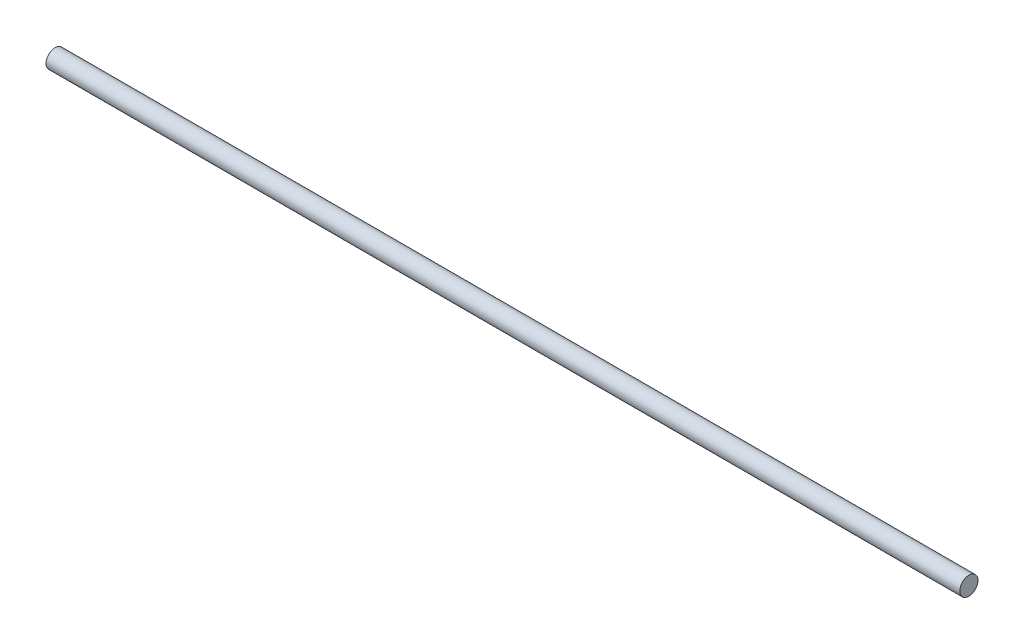
ISO-10303-21;
HEADER;
FILE_DESCRIPTION(('STEP AP214'),'2;1');
FILE_NAME('part.step','',(''),(''),'','','');
FILE_SCHEMA(('AUTOMOTIVE_DESIGN { 1 0 10303 214 1 1 1 1 }'));
ENDSEC;
DATA;
#1=APPLICATION_CONTEXT('core data for automotive mechanical design processes');
#2=APPLICATION_PROTOCOL_DEFINITION('international standard','automotive_design',2000,#1);
#3=PRODUCT_CONTEXT('',#1,'mechanical');
#4=PRODUCT('Part','Part','',(#3));
#5=PRODUCT_RELATED_PRODUCT_CATEGORY('part','',(#4));
#6=PRODUCT_DEFINITION_FORMATION('','',#4);
#7=PRODUCT_DEFINITION_CONTEXT('part definition',#1,'design');
#8=PRODUCT_DEFINITION('design','',#6,#7);
#9=PRODUCT_DEFINITION_SHAPE('','',#8);
#10=(LENGTH_UNIT() NAMED_UNIT(*) SI_UNIT(.MILLI.,.METRE.));
#11=(NAMED_UNIT(*) PLANE_ANGLE_UNIT() SI_UNIT($,.RADIAN.));
#12=(NAMED_UNIT(*) SI_UNIT($,.STERADIAN.) SOLID_ANGLE_UNIT());
#13=UNCERTAINTY_MEASURE_WITH_UNIT(LENGTH_MEASURE(1.E-05),#10,'distance_accuracy_value','');
#14=(GEOMETRIC_REPRESENTATION_CONTEXT(3) GLOBAL_UNCERTAINTY_ASSIGNED_CONTEXT((#13)) GLOBAL_UNIT_ASSIGNED_CONTEXT((#10,
#11,#12)) REPRESENTATION_CONTEXT('',''));
#15=CARTESIAN_POINT('',(0.,0.,0.));
#16=DIRECTION('',(0.,0.,1.));
#17=DIRECTION('',(1.,0.,0.));
#18=AXIS2_PLACEMENT_3D('',#15,#16,#17);
#19=CARTESIAN_POINT('',(793.75,0.,0.));
#20=DIRECTION('',(-1.,0.,0.));
#21=DIRECTION('',(0.,0.,1.));
#22=AXIS2_PLACEMENT_3D('',#19,#20,#21);
#23=CYLINDRICAL_SURFACE('',#22,9.52499999999999);
#24=CARTESIAN_POINT('',(793.75,0.,0.));
#25=DIRECTION('',(1.,0.,0.));
#26=DIRECTION('',(0.,0.,-1.));
#27=AXIS2_PLACEMENT_3D('',#24,#25,#26);
#28=CIRCLE('',#27,9.52499999999999);
#29=CARTESIAN_POINT('',(793.75,0.,9.52499999999999));
#30=VERTEX_POINT('',#29);
#31=EDGE_CURVE('E10',#30,#30,#28,.T.);
#32=CARTESIAN_POINT('',(-158.75,0.,0.));
#33=DIRECTION('',(1.,0.,0.));
#34=DIRECTION('',(0.,0.,-1.));
#35=AXIS2_PLACEMENT_3D('',#32,#33,#34);
#36=CIRCLE('',#35,9.52499999999999);
#37=CARTESIAN_POINT('',(-158.75,0.,9.52499999999999));
#38=VERTEX_POINT('',#37);
#39=EDGE_CURVE('E36',#38,#38,#36,.T.);
#40=CARTESIAN_POINT('',(793.75,0.,9.52499999999999));
#41=CARTESIAN_POINT('',(783.828125,0.,9.52499999999999));
#42=CARTESIAN_POINT('',(773.90625,0.,9.52499999999999));
#43=CARTESIAN_POINT('',(754.0625,0.,9.52499999999999));
#44=CARTESIAN_POINT('',(744.140625,0.,9.52499999999999));
#45=CARTESIAN_POINT('',(724.296875,0.,9.52499999999999));
#46=CARTESIAN_POINT('',(714.375,0.,9.52499999999999));
#47=CARTESIAN_POINT('',(694.53125,0.,9.52499999999999));
#48=CARTESIAN_POINT('',(684.609375,0.,9.52499999999999));
#49=CARTESIAN_POINT('',(664.765625,0.,9.52499999999999));
#50=CARTESIAN_POINT('',(654.84375,0.,9.52499999999999));
#51=CARTESIAN_POINT('',(635.,0.,9.52499999999999));
#52=CARTESIAN_POINT('',(625.078125,0.,9.52499999999999));
#53=CARTESIAN_POINT('',(605.234375,0.,9.52499999999999));
#54=CARTESIAN_POINT('',(595.3125,0.,9.52499999999999));
#55=CARTESIAN_POINT('',(575.46875,0.,9.52499999999999));
#56=CARTESIAN_POINT('',(565.546875,0.,9.52499999999999));
#57=CARTESIAN_POINT('',(545.703125,0.,9.52499999999999));
#58=CARTESIAN_POINT('',(535.78125,0.,9.52499999999999));
#59=CARTESIAN_POINT('',(515.9375,0.,9.52499999999999));
#60=CARTESIAN_POINT('',(506.015625,0.,9.52499999999999));
#61=CARTESIAN_POINT('',(486.171875,0.,9.52499999999999));
#62=CARTESIAN_POINT('',(476.25,0.,9.52499999999999));
#63=CARTESIAN_POINT('',(456.40625,0.,9.52499999999999));
#64=CARTESIAN_POINT('',(446.484375,0.,9.52499999999999));
#65=CARTESIAN_POINT('',(426.640625,0.,9.52499999999999));
#66=CARTESIAN_POINT('',(416.71875,0.,9.52499999999999));
#67=CARTESIAN_POINT('',(396.875,0.,9.52499999999999));
#68=CARTESIAN_POINT('',(386.953125,0.,9.52499999999999));
#69=CARTESIAN_POINT('',(367.109375,0.,9.52499999999999));
#70=CARTESIAN_POINT('',(357.1875,0.,9.52499999999999));
#71=CARTESIAN_POINT('',(337.34375,0.,9.52499999999999));
#72=CARTESIAN_POINT('',(327.421875,0.,9.52499999999999));
#73=CARTESIAN_POINT('',(307.578125,0.,9.52499999999999));
#74=CARTESIAN_POINT('',(297.65625,0.,9.52499999999999));
#75=CARTESIAN_POINT('',(277.8125,0.,9.52499999999999));
#76=CARTESIAN_POINT('',(267.890625,0.,9.52499999999999));
#77=CARTESIAN_POINT('',(248.046875,0.,9.52499999999999));
#78=CARTESIAN_POINT('',(238.125,0.,9.52499999999999));
#79=CARTESIAN_POINT('',(218.28125,0.,9.52499999999999));
#80=CARTESIAN_POINT('',(208.359375,0.,9.52499999999999));
#81=CARTESIAN_POINT('',(188.515625,0.,9.52499999999999));
#82=CARTESIAN_POINT('',(178.59375,0.,9.52499999999999));
#83=CARTESIAN_POINT('',(158.75,0.,9.52499999999999));
#84=CARTESIAN_POINT('',(148.828125,0.,9.52499999999999));
#85=CARTESIAN_POINT('',(128.984375,0.,9.52499999999999));
#86=CARTESIAN_POINT('',(119.0625,0.,9.52499999999999));
#87=CARTESIAN_POINT('',(99.21875,0.,9.52499999999999));
#88=CARTESIAN_POINT('',(89.296875,0.,9.52499999999999));
#89=CARTESIAN_POINT('',(69.453125,0.,9.52499999999999));
#90=CARTESIAN_POINT('',(59.53125,0.,9.52499999999999));
#91=CARTESIAN_POINT('',(39.6875,0.,9.52499999999999));
#92=CARTESIAN_POINT('',(29.7656249999999,0.,9.52499999999999));
#93=CARTESIAN_POINT('',(9.92187499999993,0.,9.52499999999999));
#94=CARTESIAN_POINT('',(0.,0.,9.52499999999999));
#95=CARTESIAN_POINT('',(-19.84375,0.,9.52499999999999));
#96=CARTESIAN_POINT('',(-29.765625,0.,9.52499999999999));
#97=CARTESIAN_POINT('',(-49.609375,0.,9.52499999999999));
#98=CARTESIAN_POINT('',(-59.53125,0.,9.52499999999999));
#99=CARTESIAN_POINT('',(-79.375,0.,9.52499999999999));
#100=CARTESIAN_POINT('',(-89.296875,0.,9.52499999999999));
#101=CARTESIAN_POINT('',(-109.140625,0.,9.52499999999999));
#102=CARTESIAN_POINT('',(-119.0625,0.,9.52499999999999));
#103=CARTESIAN_POINT('',(-138.90625,0.,9.52499999999999));
#104=CARTESIAN_POINT('',(-148.828125,0.,9.52499999999999));
#105=CARTESIAN_POINT('',(-158.75,0.,9.52499999999999));
#106=B_SPLINE_CURVE_WITH_KNOTS('',3,(#40,#41,#42,#43,#44,#45,#46,#47,#48,#49,#50,#51,#52,#53,
#54,#55,#56,#57,#58,#59,#60,#61,#62,#63,#64,#65,#66,#67,#68,#69,#70,#71,#72,#73,#74,#75,#76,#77,
#78,#79,#80,#81,#82,#83,#84,#85,#86,#87,#88,#89,#90,#91,#92,#93,#94,#95,#96,#97,#98,#99,#100,
#101,#102,#103,#104,#105),.UNSPECIFIED.,.F.,.F.,(4,2,2,2,2,2,2,2,2,2,2,2,2,2,2,2,2,2,2,2,2,2,2,
2,2,2,2,2,2,2,2,2,4),(0.,29.765625,59.53125,89.2968750000001,119.0625,148.828125,178.59375,
208.359375,238.125,267.890625,297.65625,327.421875,357.1875,386.953125,416.71875,446.484375,
476.25,506.015625,535.78125,565.546875,595.3125,625.078125,654.84375,684.609375,714.375,
744.140625,773.90625,803.671875,833.4375,863.203125,892.96875,922.734375,952.5),.UNSPECIFIED.);
#107=EDGE_CURVE('BSEAM33',#30,#38,#106,.T.);
#108=ORIENTED_EDGE('',*,*,#31,.F.);
#109=ORIENTED_EDGE('',*,*,#39,.T.);
#110=ORIENTED_EDGE('',*,*,#107,.T.);
#111=ORIENTED_EDGE('',*,*,#107,.F.);
#112=EDGE_LOOP('',(#108,#110,#109,#111));
#113=FACE_BOUND('',#112,.T.);
#114=ADVANCED_FACE('F33',(#113),#23,.T.);
#115=CARTESIAN_POINT('',(793.75,0.,0.));
#116=DIRECTION('',(1.,0.,0.));
#117=DIRECTION('',(0.,0.,-1.));
#118=AXIS2_PLACEMENT_3D('',#115,#116,#117);
#119=PLANE('',#118);
#120=ORIENTED_EDGE('',*,*,#31,.T.);
#121=EDGE_LOOP('',(#120));
#122=FACE_BOUND('',#121,.T.);
#123=ADVANCED_FACE('F48',(#122),#119,.T.);
#124=CARTESIAN_POINT('',(-158.75,0.,0.));
#125=DIRECTION('',(1.,0.,0.));
#126=DIRECTION('',(0.,0.,-1.));
#127=AXIS2_PLACEMENT_3D('',#124,#125,#126);
#128=PLANE('',#127);
#129=ORIENTED_EDGE('',*,*,#39,.F.);
#130=EDGE_LOOP('',(#129));
#131=FACE_BOUND('',#130,.T.);
#132=ADVANCED_FACE('F46',(#131),#128,.F.);
#133=CLOSED_SHELL('',(#114,#123,#132));
#134=MANIFOLD_SOLID_BREP('B2',#133);
#135=ADVANCED_BREP_SHAPE_REPRESENTATION('',(#18,#134),#14);
#136=SHAPE_DEFINITION_REPRESENTATION(#9,#135);
ENDSEC;
END-ISO-10303-21;
